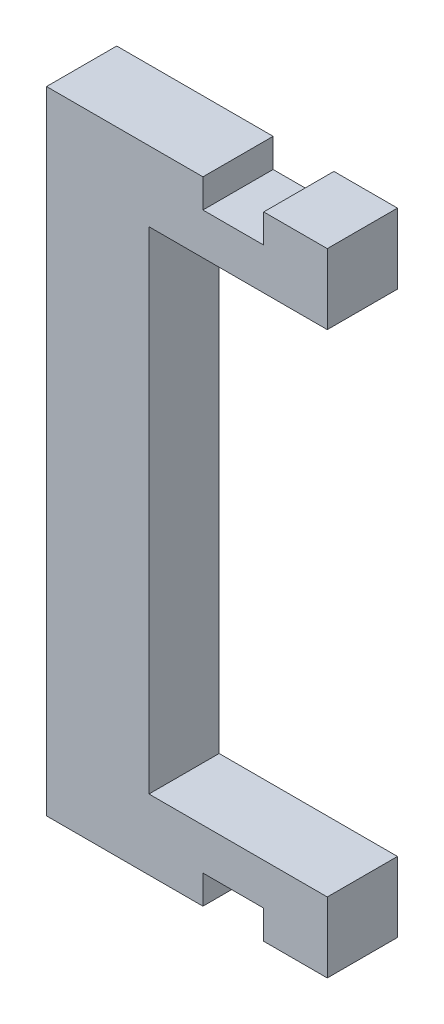
ISO-10303-21;
HEADER;
FILE_DESCRIPTION(('STEP AP214'),'2;1');
FILE_NAME('part.step','',(''),(''),'','','');
FILE_SCHEMA(('AUTOMOTIVE_DESIGN { 1 0 10303 214 1 1 1 1 }'));
ENDSEC;
DATA;
#1=APPLICATION_CONTEXT('core data for automotive mechanical design processes');
#2=APPLICATION_PROTOCOL_DEFINITION('international standard','automotive_design',2000,#1);
#3=PRODUCT_CONTEXT('',#1,'mechanical');
#4=PRODUCT('Part','Part','',(#3));
#5=PRODUCT_RELATED_PRODUCT_CATEGORY('part','',(#4));
#6=PRODUCT_DEFINITION_FORMATION('','',#4);
#7=PRODUCT_DEFINITION_CONTEXT('part definition',#1,'design');
#8=PRODUCT_DEFINITION('design','',#6,#7);
#9=PRODUCT_DEFINITION_SHAPE('','',#8);
#10=(LENGTH_UNIT() NAMED_UNIT(*) SI_UNIT(.MILLI.,.METRE.));
#11=(NAMED_UNIT(*) PLANE_ANGLE_UNIT() SI_UNIT($,.RADIAN.));
#12=(NAMED_UNIT(*) SI_UNIT($,.STERADIAN.) SOLID_ANGLE_UNIT());
#13=UNCERTAINTY_MEASURE_WITH_UNIT(LENGTH_MEASURE(1.E-05),#10,'distance_accuracy_value','');
#14=(GEOMETRIC_REPRESENTATION_CONTEXT(3) GLOBAL_UNCERTAINTY_ASSIGNED_CONTEXT((#13)) GLOBAL_UNIT_ASSIGNED_CONTEXT((#10,
#11,#12)) REPRESENTATION_CONTEXT('',''));
#15=CARTESIAN_POINT('',(0.,0.,0.));
#16=DIRECTION('',(0.,0.,1.));
#17=DIRECTION('',(1.,0.,0.));
#18=AXIS2_PLACEMENT_3D('',#15,#16,#17);
#19=CARTESIAN_POINT('',(-45.,0.,25.4));
#20=DIRECTION('',(1.,0.,0.));
#21=DIRECTION('',(0.,0.,-1.));
#22=AXIS2_PLACEMENT_3D('',#19,#20,#21);
#23=PLANE('',#22);
#24=DIRECTION('',(0.,-1.,0.));
#25=VECTOR('',#24,1.);
#26=CARTESIAN_POINT('',(-45.,0.,0.));
#27=LINE('',#26,#25);
#28=CARTESIAN_POINT('',(-45.,228.6,0.));
#29=VERTEX_POINT('',#28);
#30=CARTESIAN_POINT('',(-45.,218.2,0.));
#31=VERTEX_POINT('',#30);
#32=EDGE_CURVE('E186',#29,#31,#27,.T.);
#33=ORIENTED_EDGE('',*,*,#32,.F.);
#34=DIRECTION('',(0.,0.,-1.));
#35=VECTOR('',#34,1.);
#36=CARTESIAN_POINT('',(-45.,228.6,25.4));
#37=LINE('',#36,#35);
#38=CARTESIAN_POINT('',(-45.,228.6,25.4));
#39=VERTEX_POINT('',#38);
#40=EDGE_CURVE('E11',#39,#29,#37,.T.);
#41=ORIENTED_EDGE('',*,*,#40,.F.);
#42=DIRECTION('',(0.,-1.,0.));
#43=VECTOR('',#42,1.);
#44=CARTESIAN_POINT('',(-45.,0.,25.4));
#45=LINE('',#44,#43);
#46=CARTESIAN_POINT('',(-45.,218.2,25.4));
#47=VERTEX_POINT('',#46);
#48=EDGE_CURVE('E222',#39,#47,#45,.T.);
#49=ORIENTED_EDGE('',*,*,#48,.T.);
#50=DIRECTION('',(0.,0.,-1.));
#51=VECTOR('',#50,1.);
#52=CARTESIAN_POINT('',(-45.,218.2,25.4));
#53=LINE('',#52,#51);
#54=EDGE_CURVE('E116',#47,#31,#53,.T.);
#55=ORIENTED_EDGE('',*,*,#54,.T.);
#56=EDGE_LOOP('',(#33,#41,#49,#55));
#57=FACE_BOUND('',#56,.T.);
#58=ADVANCED_FACE('F41',(#57),#23,.T.);
#59=CARTESIAN_POINT('',(0.,228.6,25.4));
#60=DIRECTION('',(0.,-1.,0.));
#61=DIRECTION('',(0.,0.,-1.));
#62=AXIS2_PLACEMENT_3D('',#59,#60,#61);
#63=PLANE('',#62);
#64=DIRECTION('',(-1.,0.,0.));
#65=VECTOR('',#64,1.);
#66=CARTESIAN_POINT('',(0.,228.6,0.));
#67=LINE('',#66,#65);
#68=CARTESIAN_POINT('',(-101.6,228.6,0.));
#69=VERTEX_POINT('',#68);
#70=EDGE_CURVE('E189',#29,#69,#67,.T.);
#71=ORIENTED_EDGE('',*,*,#70,.T.);
#72=DIRECTION('',(0.,0.,-1.));
#73=VECTOR('',#72,1.);
#74=CARTESIAN_POINT('',(-101.6,228.6,25.4));
#75=LINE('',#74,#73);
#76=CARTESIAN_POINT('',(-101.6,228.6,25.4));
#77=VERTEX_POINT('',#76);
#78=EDGE_CURVE('E49',#77,#69,#75,.T.);
#79=ORIENTED_EDGE('',*,*,#78,.F.);
#80=DIRECTION('',(-1.,0.,0.));
#81=VECTOR('',#80,1.);
#82=CARTESIAN_POINT('',(0.,228.6,25.4));
#83=LINE('',#82,#81);
#84=EDGE_CURVE('E171',#39,#77,#83,.T.);
#85=ORIENTED_EDGE('',*,*,#84,.F.);
#86=ORIENTED_EDGE('',*,*,#40,.T.);
#87=EDGE_LOOP('',(#71,#79,#85,#86));
#88=FACE_BOUND('',#87,.T.);
#89=ADVANCED_FACE('F256',(#88),#63,.F.);
#90=CARTESIAN_POINT('',(-101.6,0.,25.4));
#91=DIRECTION('',(-1.,0.,0.));
#92=DIRECTION('',(0.,0.,1.));
#93=AXIS2_PLACEMENT_3D('',#90,#91,#92);
#94=PLANE('',#93);
#95=DIRECTION('',(0.,1.,0.));
#96=VECTOR('',#95,1.);
#97=CARTESIAN_POINT('',(-101.6,0.,0.));
#98=LINE('',#97,#96);
#99=CARTESIAN_POINT('',(-101.6,0.,0.));
#100=VERTEX_POINT('',#99);
#101=EDGE_CURVE('E192',#100,#69,#98,.T.);
#102=ORIENTED_EDGE('',*,*,#101,.F.);
#103=DIRECTION('',(0.,0.,-1.));
#104=VECTOR('',#103,1.);
#105=CARTESIAN_POINT('',(-101.6,0.,25.4));
#106=LINE('',#105,#104);
#107=CARTESIAN_POINT('',(-101.6,0.,25.4));
#108=VERTEX_POINT('',#107);
#109=EDGE_CURVE('E246',#108,#100,#106,.T.);
#110=ORIENTED_EDGE('',*,*,#109,.F.);
#111=DIRECTION('',(0.,1.,0.));
#112=VECTOR('',#111,1.);
#113=CARTESIAN_POINT('',(-101.6,0.,25.4));
#114=LINE('',#113,#112);
#115=EDGE_CURVE('E253',#108,#77,#114,.T.);
#116=ORIENTED_EDGE('',*,*,#115,.T.);
#117=ORIENTED_EDGE('',*,*,#78,.T.);
#118=EDGE_LOOP('',(#102,#110,#116,#117));
#119=FACE_BOUND('',#118,.T.);
#120=ADVANCED_FACE('F251',(#119),#94,.T.);
#121=CARTESIAN_POINT('',(0.,0.,25.4));
#122=DIRECTION('',(0.,-1.,0.));
#123=DIRECTION('',(0.,0.,-1.));
#124=AXIS2_PLACEMENT_3D('',#121,#122,#123);
#125=PLANE('',#124);
#126=DIRECTION('',(-1.,0.,0.));
#127=VECTOR('',#126,1.);
#128=CARTESIAN_POINT('',(0.,0.,0.));
#129=LINE('',#128,#127);
#130=CARTESIAN_POINT('',(-45.,0.,0.));
#131=VERTEX_POINT('',#130);
#132=EDGE_CURVE('E195',#131,#100,#129,.T.);
#133=ORIENTED_EDGE('',*,*,#132,.F.);
#134=DIRECTION('',(0.,0.,-1.));
#135=VECTOR('',#134,1.);
#136=CARTESIAN_POINT('',(-45.,0.,25.4));
#137=LINE('',#136,#135);
#138=CARTESIAN_POINT('',(-45.,0.,25.4));
#139=VERTEX_POINT('',#138);
#140=EDGE_CURVE('E244',#139,#131,#137,.T.);
#141=ORIENTED_EDGE('',*,*,#140,.F.);
#142=DIRECTION('',(-1.,0.,0.));
#143=VECTOR('',#142,1.);
#144=CARTESIAN_POINT('',(0.,0.,25.4));
#145=LINE('',#144,#143);
#146=EDGE_CURVE('E266',#139,#108,#145,.T.);
#147=ORIENTED_EDGE('',*,*,#146,.T.);
#148=ORIENTED_EDGE('',*,*,#109,.T.);
#149=EDGE_LOOP('',(#133,#141,#147,#148));
#150=FACE_BOUND('',#149,.T.);
#151=ADVANCED_FACE('F262',(#150),#125,.T.);
#152=CARTESIAN_POINT('',(-45.,0.,25.4));
#153=DIRECTION('',(-1.,0.,0.));
#154=DIRECTION('',(0.,0.,1.));
#155=AXIS2_PLACEMENT_3D('',#152,#153,#154);
#156=PLANE('',#155);
#157=DIRECTION('',(0.,1.,0.));
#158=VECTOR('',#157,1.);
#159=CARTESIAN_POINT('',(-45.,0.,0.));
#160=LINE('',#159,#158);
#161=CARTESIAN_POINT('',(-45.,10.4,0.));
#162=VERTEX_POINT('',#161);
#163=EDGE_CURVE('E198',#131,#162,#160,.T.);
#164=ORIENTED_EDGE('',*,*,#163,.T.);
#165=DIRECTION('',(0.,0.,-1.));
#166=VECTOR('',#165,1.);
#167=CARTESIAN_POINT('',(-45.,10.4,25.4));
#168=LINE('',#167,#166);
#169=CARTESIAN_POINT('',(-45.,10.4,25.4));
#170=VERTEX_POINT('',#169);
#171=EDGE_CURVE('E242',#170,#162,#168,.T.);
#172=ORIENTED_EDGE('',*,*,#171,.F.);
#173=DIRECTION('',(0.,1.,0.));
#174=VECTOR('',#173,1.);
#175=CARTESIAN_POINT('',(-45.,0.,25.4));
#176=LINE('',#175,#174);
#177=EDGE_CURVE('E268',#139,#170,#176,.T.);
#178=ORIENTED_EDGE('',*,*,#177,.F.);
#179=ORIENTED_EDGE('',*,*,#140,.T.);
#180=EDGE_LOOP('',(#164,#172,#178,#179));
#181=FACE_BOUND('',#180,.T.);
#182=ADVANCED_FACE('F351',(#181),#156,.F.);
#183=CARTESIAN_POINT('',(0.,10.4,25.4));
#184=DIRECTION('',(0.,-1.,0.));
#185=DIRECTION('',(0.,0.,-1.));
#186=AXIS2_PLACEMENT_3D('',#183,#184,#185);
#187=PLANE('',#186);
#188=DIRECTION('',(-1.,0.,0.));
#189=VECTOR('',#188,1.);
#190=CARTESIAN_POINT('',(0.,10.4,0.));
#191=LINE('',#190,#189);
#192=CARTESIAN_POINT('',(-23.,10.4,0.));
#193=VERTEX_POINT('',#192);
#194=EDGE_CURVE('E202',#193,#162,#191,.T.);
#195=ORIENTED_EDGE('',*,*,#194,.F.);
#196=DIRECTION('',(0.,0.,-1.));
#197=VECTOR('',#196,1.);
#198=CARTESIAN_POINT('',(-23.,10.4,25.4));
#199=LINE('',#198,#197);
#200=CARTESIAN_POINT('',(-23.,10.4,25.4));
#201=VERTEX_POINT('',#200);
#202=EDGE_CURVE('E240',#201,#193,#199,.T.);
#203=ORIENTED_EDGE('',*,*,#202,.F.);
#204=DIRECTION('',(-1.,0.,0.));
#205=VECTOR('',#204,1.);
#206=CARTESIAN_POINT('',(0.,10.4,25.4));
#207=LINE('',#206,#205);
#208=EDGE_CURVE('E274',#201,#170,#207,.T.);
#209=ORIENTED_EDGE('',*,*,#208,.T.);
#210=ORIENTED_EDGE('',*,*,#171,.T.);
#211=EDGE_LOOP('',(#195,#203,#209,#210));
#212=FACE_BOUND('',#211,.T.);
#213=ADVANCED_FACE('F347',(#212),#187,.T.);
#214=CARTESIAN_POINT('',(-23.,0.,25.4));
#215=DIRECTION('',(-1.,0.,0.));
#216=DIRECTION('',(0.,0.,1.));
#217=AXIS2_PLACEMENT_3D('',#214,#215,#216);
#218=PLANE('',#217);
#219=DIRECTION('',(0.,1.,0.));
#220=VECTOR('',#219,1.);
#221=CARTESIAN_POINT('',(-23.,0.,0.));
#222=LINE('',#221,#220);
#223=CARTESIAN_POINT('',(-23.,0.,0.));
#224=VERTEX_POINT('',#223);
#225=EDGE_CURVE('E205',#224,#193,#222,.T.);
#226=ORIENTED_EDGE('',*,*,#225,.F.);
#227=DIRECTION('',(0.,0.,-1.));
#228=VECTOR('',#227,1.);
#229=CARTESIAN_POINT('',(-23.,0.,25.4));
#230=LINE('',#229,#228);
#231=CARTESIAN_POINT('',(-23.,0.,25.4));
#232=VERTEX_POINT('',#231);
#233=EDGE_CURVE('E238',#232,#224,#230,.T.);
#234=ORIENTED_EDGE('',*,*,#233,.F.);
#235=DIRECTION('',(0.,1.,0.));
#236=VECTOR('',#235,1.);
#237=CARTESIAN_POINT('',(-23.,0.,25.4));
#238=LINE('',#237,#236);
#239=EDGE_CURVE('E277',#232,#201,#238,.T.);
#240=ORIENTED_EDGE('',*,*,#239,.T.);
#241=ORIENTED_EDGE('',*,*,#202,.T.);
#242=EDGE_LOOP('',(#226,#234,#240,#241));
#243=FACE_BOUND('',#242,.T.);
#244=ADVANCED_FACE('F327',(#243),#218,.T.);
#245=CARTESIAN_POINT('',(0.,0.,0.));
#246=VERTEX_POINT('',#245);
#247=EDGE_CURVE('E199',#246,#224,#129,.T.);
#248=ORIENTED_EDGE('',*,*,#247,.F.);
#249=DIRECTION('',(0.,0.,-1.));
#250=VECTOR('',#249,1.);
#251=CARTESIAN_POINT('',(0.,0.,25.4));
#252=LINE('',#251,#250);
#253=CARTESIAN_POINT('',(0.,0.,25.4));
#254=VERTEX_POINT('',#253);
#255=EDGE_CURVE('E236',#254,#246,#252,.T.);
#256=ORIENTED_EDGE('',*,*,#255,.F.);
#257=EDGE_CURVE('E270',#254,#232,#145,.T.);
#258=ORIENTED_EDGE('',*,*,#257,.T.);
#259=ORIENTED_EDGE('',*,*,#233,.T.);
#260=EDGE_LOOP('',(#248,#256,#258,#259));
#261=FACE_BOUND('',#260,.T.);
#262=ADVANCED_FACE('F319',(#261),#125,.T.);
#263=CARTESIAN_POINT('',(0.,0.,25.4));
#264=DIRECTION('',(-1.,0.,0.));
#265=DIRECTION('',(0.,0.,1.));
#266=AXIS2_PLACEMENT_3D('',#263,#264,#265);
#267=PLANE('',#266);
#268=DIRECTION('',(0.,1.,0.));
#269=VECTOR('',#268,1.);
#270=CARTESIAN_POINT('',(0.,0.,0.));
#271=LINE('',#270,#269);
#272=CARTESIAN_POINT('',(0.,25.4,0.));
#273=VERTEX_POINT('',#272);
#274=EDGE_CURVE('E208',#246,#273,#271,.T.);
#275=ORIENTED_EDGE('',*,*,#274,.T.);
#276=DIRECTION('',(0.,0.,-1.));
#277=VECTOR('',#276,1.);
#278=CARTESIAN_POINT('',(0.,25.4,25.4));
#279=LINE('',#278,#277);
#280=CARTESIAN_POINT('',(0.,25.4,25.4));
#281=VERTEX_POINT('',#280);
#282=EDGE_CURVE('E233',#281,#273,#279,.T.);
#283=ORIENTED_EDGE('',*,*,#282,.F.);
#284=DIRECTION('',(0.,1.,0.));
#285=VECTOR('',#284,1.);
#286=CARTESIAN_POINT('',(0.,0.,25.4));
#287=LINE('',#286,#285);
#288=EDGE_CURVE('E280',#254,#281,#287,.T.);
#289=ORIENTED_EDGE('',*,*,#288,.F.);
#290=ORIENTED_EDGE('',*,*,#255,.T.);
#291=EDGE_LOOP('',(#275,#283,#289,#290));
#292=FACE_BOUND('',#291,.T.);
#293=ADVANCED_FACE('F311',(#292),#267,.F.);
#294=CARTESIAN_POINT('',(0.,25.4,25.4));
#295=DIRECTION('',(0.,-1.,0.));
#296=DIRECTION('',(0.,0.,-1.));
#297=AXIS2_PLACEMENT_3D('',#294,#295,#296);
#298=PLANE('',#297);
#299=DIRECTION('',(-1.,0.,0.));
#300=VECTOR('',#299,1.);
#301=CARTESIAN_POINT('',(0.,25.4,0.));
#302=LINE('',#301,#300);
#303=CARTESIAN_POINT('',(-64.5305369681549,25.4,0.));
#304=VERTEX_POINT('',#303);
#305=EDGE_CURVE('E210',#273,#304,#302,.T.);
#306=ORIENTED_EDGE('',*,*,#305,.T.);
#307=DIRECTION('',(0.,0.,-1.));
#308=VECTOR('',#307,1.);
#309=CARTESIAN_POINT('',(-64.5305369681549,25.4,25.4));
#310=LINE('',#309,#308);
#311=CARTESIAN_POINT('',(-64.5305369681549,25.4,25.4));
#312=VERTEX_POINT('',#311);
#313=EDGE_CURVE('E230',#312,#304,#310,.T.);
#314=ORIENTED_EDGE('',*,*,#313,.F.);
#315=DIRECTION('',(-1.,0.,0.));
#316=VECTOR('',#315,1.);
#317=CARTESIAN_POINT('',(0.,25.4,25.4));
#318=LINE('',#317,#316);
#319=EDGE_CURVE('E282',#281,#312,#318,.T.);
#320=ORIENTED_EDGE('',*,*,#319,.F.);
#321=ORIENTED_EDGE('',*,*,#282,.T.);
#322=EDGE_LOOP('',(#306,#314,#320,#321));
#323=FACE_BOUND('',#322,.T.);
#324=ADVANCED_FACE('F318',(#323),#298,.F.);
#325=CARTESIAN_POINT('',(-64.5305369681549,0.,25.4));
#326=DIRECTION('',(-1.,0.,0.));
#327=DIRECTION('',(0.,0.,1.));
#328=AXIS2_PLACEMENT_3D('',#325,#326,#327);
#329=PLANE('',#328);
#330=DIRECTION('',(0.,1.,0.));
#331=VECTOR('',#330,1.);
#332=CARTESIAN_POINT('',(-64.5305369681549,0.,0.));
#333=LINE('',#332,#331);
#334=CARTESIAN_POINT('',(-64.5305369681549,203.2,0.));
#335=VERTEX_POINT('',#334);
#336=EDGE_CURVE('E213',#304,#335,#333,.T.);
#337=ORIENTED_EDGE('',*,*,#336,.T.);
#338=DIRECTION('',(0.,0.,-1.));
#339=VECTOR('',#338,1.);
#340=CARTESIAN_POINT('',(-64.5305369681549,203.2,25.4));
#341=LINE('',#340,#339);
#342=CARTESIAN_POINT('',(-64.5305369681549,203.2,25.4));
#343=VERTEX_POINT('',#342);
#344=EDGE_CURVE('E228',#343,#335,#341,.T.);
#345=ORIENTED_EDGE('',*,*,#344,.F.);
#346=DIRECTION('',(0.,1.,0.));
#347=VECTOR('',#346,1.);
#348=CARTESIAN_POINT('',(-64.5305369681549,0.,25.4));
#349=LINE('',#348,#347);
#350=EDGE_CURVE('E283',#312,#343,#349,.T.);
#351=ORIENTED_EDGE('',*,*,#350,.F.);
#352=ORIENTED_EDGE('',*,*,#313,.T.);
#353=EDGE_LOOP('',(#337,#345,#351,#352));
#354=FACE_BOUND('',#353,.T.);
#355=ADVANCED_FACE('F315',(#354),#329,.F.);
#356=CARTESIAN_POINT('',(0.,203.2,25.4));
#357=DIRECTION('',(0.,-1.,0.));
#358=DIRECTION('',(0.,0.,-1.));
#359=AXIS2_PLACEMENT_3D('',#356,#357,#358);
#360=PLANE('',#359);
#361=DIRECTION('',(-1.,0.,0.));
#362=VECTOR('',#361,1.);
#363=CARTESIAN_POINT('',(0.,203.2,0.));
#364=LINE('',#363,#362);
#365=CARTESIAN_POINT('',(0.,203.2,0.));
#366=VERTEX_POINT('',#365);
#367=EDGE_CURVE('E216',#366,#335,#364,.T.);
#368=ORIENTED_EDGE('',*,*,#367,.F.);
#369=DIRECTION('',(0.,0.,-1.));
#370=VECTOR('',#369,1.);
#371=CARTESIAN_POINT('',(0.,203.2,25.4));
#372=LINE('',#371,#370);
#373=CARTESIAN_POINT('',(0.,203.2,25.4));
#374=VERTEX_POINT('',#373);
#375=EDGE_CURVE('E226',#374,#366,#372,.T.);
#376=ORIENTED_EDGE('',*,*,#375,.F.);
#377=DIRECTION('',(-1.,0.,0.));
#378=VECTOR('',#377,1.);
#379=CARTESIAN_POINT('',(0.,203.2,25.4));
#380=LINE('',#379,#378);
#381=EDGE_CURVE('E183',#374,#343,#380,.T.);
#382=ORIENTED_EDGE('',*,*,#381,.T.);
#383=ORIENTED_EDGE('',*,*,#344,.T.);
#384=EDGE_LOOP('',(#368,#376,#382,#383));
#385=FACE_BOUND('',#384,.T.);
#386=ADVANCED_FACE('F289',(#385),#360,.T.);
#387=CARTESIAN_POINT('',(0.,228.6,0.));
#388=VERTEX_POINT('',#387);
#389=EDGE_CURVE('E211',#366,#388,#271,.T.);
#390=ORIENTED_EDGE('',*,*,#389,.T.);
#391=DIRECTION('',(0.,0.,-1.));
#392=VECTOR('',#391,1.);
#393=CARTESIAN_POINT('',(0.,228.6,25.4));
#394=LINE('',#393,#392);
#395=CARTESIAN_POINT('',(0.,228.6,25.4));
#396=VERTEX_POINT('',#395);
#397=EDGE_CURVE('E176',#396,#388,#394,.T.);
#398=ORIENTED_EDGE('',*,*,#397,.F.);
#399=EDGE_CURVE('E166',#374,#396,#287,.T.);
#400=ORIENTED_EDGE('',*,*,#399,.F.);
#401=ORIENTED_EDGE('',*,*,#375,.T.);
#402=EDGE_LOOP('',(#390,#398,#400,#401));
#403=FACE_BOUND('',#402,.T.);
#404=ADVANCED_FACE('F292',(#403),#267,.F.);
#405=CARTESIAN_POINT('',(-23.,228.6,0.));
#406=VERTEX_POINT('',#405);
#407=EDGE_CURVE('E175',#388,#406,#67,.T.);
#408=ORIENTED_EDGE('',*,*,#407,.T.);
#409=DIRECTION('',(0.,0.,-1.));
#410=VECTOR('',#409,1.);
#411=CARTESIAN_POINT('',(-23.,228.6,25.4));
#412=LINE('',#411,#410);
#413=CARTESIAN_POINT('',(-23.,228.6,25.4));
#414=VERTEX_POINT('',#413);
#415=EDGE_CURVE('E172',#414,#406,#412,.T.);
#416=ORIENTED_EDGE('',*,*,#415,.F.);
#417=EDGE_CURVE('E159',#396,#414,#83,.T.);
#418=ORIENTED_EDGE('',*,*,#417,.F.);
#419=ORIENTED_EDGE('',*,*,#397,.T.);
#420=EDGE_LOOP('',(#408,#416,#418,#419));
#421=FACE_BOUND('',#420,.T.);
#422=ADVANCED_FACE('F173',(#421),#63,.F.);
#423=CARTESIAN_POINT('',(-23.,0.,25.4));
#424=DIRECTION('',(1.,0.,0.));
#425=DIRECTION('',(0.,0.,-1.));
#426=AXIS2_PLACEMENT_3D('',#423,#424,#425);
#427=PLANE('',#426);
#428=DIRECTION('',(0.,-1.,0.));
#429=VECTOR('',#428,1.);
#430=CARTESIAN_POINT('',(-23.,0.,0.));
#431=LINE('',#430,#429);
#432=CARTESIAN_POINT('',(-23.,218.2,0.));
#433=VERTEX_POINT('',#432);
#434=EDGE_CURVE('E109',#406,#433,#431,.T.);
#435=ORIENTED_EDGE('',*,*,#434,.T.);
#436=DIRECTION('',(0.,0.,-1.));
#437=VECTOR('',#436,1.);
#438=CARTESIAN_POINT('',(-23.,218.2,25.4));
#439=LINE('',#438,#437);
#440=CARTESIAN_POINT('',(-23.,218.2,25.4));
#441=VERTEX_POINT('',#440);
#442=EDGE_CURVE('E177',#441,#433,#439,.T.);
#443=ORIENTED_EDGE('',*,*,#442,.F.);
#444=DIRECTION('',(0.,-1.,0.));
#445=VECTOR('',#444,1.);
#446=CARTESIAN_POINT('',(-23.,0.,25.4));
#447=LINE('',#446,#445);
#448=EDGE_CURVE('E163',#414,#441,#447,.T.);
#449=ORIENTED_EDGE('',*,*,#448,.F.);
#450=ORIENTED_EDGE('',*,*,#415,.T.);
#451=EDGE_LOOP('',(#435,#443,#449,#450));
#452=FACE_BOUND('',#451,.T.);
#453=ADVANCED_FACE('F179',(#452),#427,.F.);
#454=CARTESIAN_POINT('',(0.,218.2,25.4));
#455=DIRECTION('',(0.,-1.,0.));
#456=DIRECTION('',(0.,0.,-1.));
#457=AXIS2_PLACEMENT_3D('',#454,#455,#456);
#458=PLANE('',#457);
#459=DIRECTION('',(-1.,0.,0.));
#460=VECTOR('',#459,1.);
#461=CARTESIAN_POINT('',(0.,218.2,0.));
#462=LINE('',#461,#460);
#463=EDGE_CURVE('E220',#433,#31,#462,.T.);
#464=ORIENTED_EDGE('',*,*,#463,.T.);
#465=ORIENTED_EDGE('',*,*,#54,.F.);
#466=DIRECTION('',(-1.,0.,0.));
#467=VECTOR('',#466,1.);
#468=CARTESIAN_POINT('',(0.,218.2,25.4));
#469=LINE('',#468,#467);
#470=EDGE_CURVE('E57',#441,#47,#469,.T.);
#471=ORIENTED_EDGE('',*,*,#470,.F.);
#472=ORIENTED_EDGE('',*,*,#442,.T.);
#473=EDGE_LOOP('',(#464,#465,#471,#472));
#474=FACE_BOUND('',#473,.T.);
#475=ADVANCED_FACE('F295',(#474),#458,.F.);
#476=CARTESIAN_POINT('',(0.,0.,25.4));
#477=DIRECTION('',(0.,0.,1.));
#478=DIRECTION('',(1.,0.,0.));
#479=AXIS2_PLACEMENT_3D('',#476,#477,#478);
#480=PLANE('',#479);
#481=ORIENTED_EDGE('',*,*,#48,.F.);
#482=ORIENTED_EDGE('',*,*,#84,.T.);
#483=ORIENTED_EDGE('',*,*,#115,.F.);
#484=ORIENTED_EDGE('',*,*,#146,.F.);
#485=ORIENTED_EDGE('',*,*,#177,.T.);
#486=ORIENTED_EDGE('',*,*,#208,.F.);
#487=ORIENTED_EDGE('',*,*,#239,.F.);
#488=ORIENTED_EDGE('',*,*,#257,.F.);
#489=ORIENTED_EDGE('',*,*,#288,.T.);
#490=ORIENTED_EDGE('',*,*,#319,.T.);
#491=ORIENTED_EDGE('',*,*,#350,.T.);
#492=ORIENTED_EDGE('',*,*,#381,.F.);
#493=ORIENTED_EDGE('',*,*,#399,.T.);
#494=ORIENTED_EDGE('',*,*,#417,.T.);
#495=ORIENTED_EDGE('',*,*,#448,.T.);
#496=ORIENTED_EDGE('',*,*,#470,.T.);
#497=EDGE_LOOP('',(#481,#482,#483,#484,#485,#486,#487,#488,#489,#490,#491,#492,#493,#494,#495,#496));
#498=FACE_BOUND('',#497,.T.);
#499=ADVANCED_FACE('F161',(#498),#480,.T.);
#500=CARTESIAN_POINT('',(0.,0.,0.));
#501=DIRECTION('',(0.,0.,1.));
#502=DIRECTION('',(1.,0.,0.));
#503=AXIS2_PLACEMENT_3D('',#500,#501,#502);
#504=PLANE('',#503);
#505=ORIENTED_EDGE('',*,*,#32,.T.);
#506=ORIENTED_EDGE('',*,*,#463,.F.);
#507=ORIENTED_EDGE('',*,*,#434,.F.);
#508=ORIENTED_EDGE('',*,*,#407,.F.);
#509=ORIENTED_EDGE('',*,*,#389,.F.);
#510=ORIENTED_EDGE('',*,*,#367,.T.);
#511=ORIENTED_EDGE('',*,*,#336,.F.);
#512=ORIENTED_EDGE('',*,*,#305,.F.);
#513=ORIENTED_EDGE('',*,*,#274,.F.);
#514=ORIENTED_EDGE('',*,*,#247,.T.);
#515=ORIENTED_EDGE('',*,*,#225,.T.);
#516=ORIENTED_EDGE('',*,*,#194,.T.);
#517=ORIENTED_EDGE('',*,*,#163,.F.);
#518=ORIENTED_EDGE('',*,*,#132,.T.);
#519=ORIENTED_EDGE('',*,*,#101,.T.);
#520=ORIENTED_EDGE('',*,*,#70,.F.);
#521=EDGE_LOOP('',(#505,#506,#507,#508,#509,#510,#511,#512,#513,#514,#515,#516,#517,#518,#519,#520));
#522=FACE_BOUND('',#521,.T.);
#523=ADVANCED_FACE('F258',(#522),#504,.F.);
#524=CLOSED_SHELL('',(#58,#89,#120,#151,#182,#213,#244,#262,#293,#324,#355,#386,#404,#422,#453,
#475,#499,#523));
#525=MANIFOLD_SOLID_BREP('B2',#524);
#526=ADVANCED_BREP_SHAPE_REPRESENTATION('',(#18,#525),#14);
#527=SHAPE_DEFINITION_REPRESENTATION(#9,#526);
ENDSEC;
END-ISO-10303-21;
